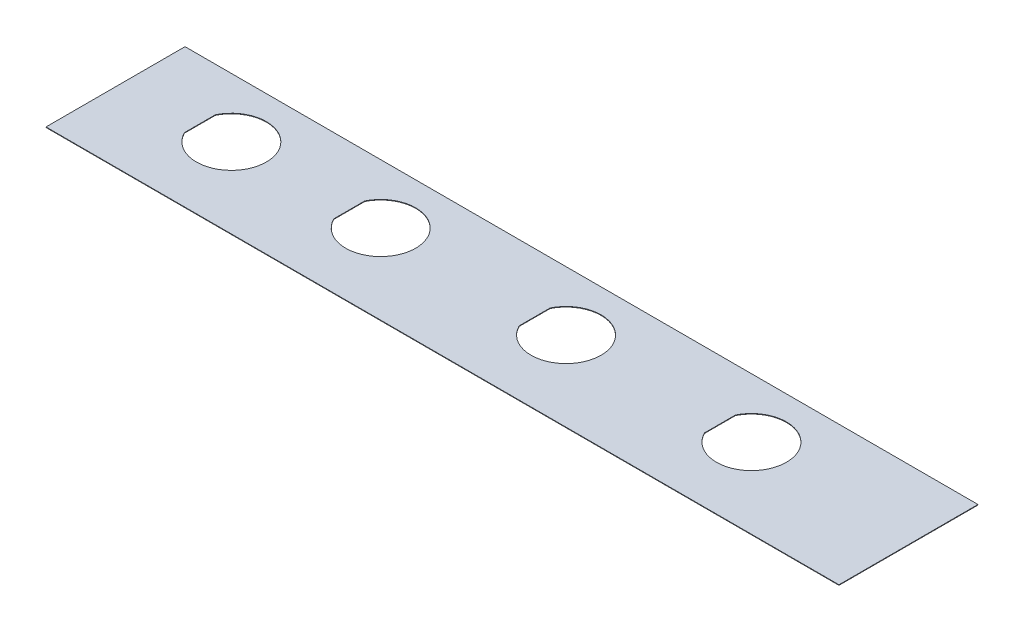
ISO-10303-21;
HEADER;
FILE_DESCRIPTION(('STEP AP214'),'2;1');
FILE_NAME('part.step','',(''),(''),'','','');
FILE_SCHEMA(('AUTOMOTIVE_DESIGN { 1 0 10303 214 1 1 1 1 }'));
ENDSEC;
DATA;
#1=APPLICATION_CONTEXT('core data for automotive mechanical design processes');
#2=APPLICATION_PROTOCOL_DEFINITION('international standard','automotive_design',2000,#1);
#3=PRODUCT_CONTEXT('',#1,'mechanical');
#4=PRODUCT('Part','Part','',(#3));
#5=PRODUCT_RELATED_PRODUCT_CATEGORY('part','',(#4));
#6=PRODUCT_DEFINITION_FORMATION('','',#4);
#7=PRODUCT_DEFINITION_CONTEXT('part definition',#1,'design');
#8=PRODUCT_DEFINITION('design','',#6,#7);
#9=PRODUCT_DEFINITION_SHAPE('','',#8);
#10=(LENGTH_UNIT() NAMED_UNIT(*) SI_UNIT(.MILLI.,.METRE.));
#11=(NAMED_UNIT(*) PLANE_ANGLE_UNIT() SI_UNIT($,.RADIAN.));
#12=(NAMED_UNIT(*) SI_UNIT($,.STERADIAN.) SOLID_ANGLE_UNIT());
#13=UNCERTAINTY_MEASURE_WITH_UNIT(LENGTH_MEASURE(1.E-05),#10,'distance_accuracy_value','');
#14=(GEOMETRIC_REPRESENTATION_CONTEXT(3) GLOBAL_UNCERTAINTY_ASSIGNED_CONTEXT((#13)) GLOBAL_UNIT_ASSIGNED_CONTEXT((#10,
#11,#12)) REPRESENTATION_CONTEXT('',''));
#15=CARTESIAN_POINT('',(0.,0.,0.));
#16=DIRECTION('',(0.,0.,1.));
#17=DIRECTION('',(1.,0.,0.));
#18=AXIS2_PLACEMENT_3D('',#15,#16,#17);
#19=CARTESIAN_POINT('',(77.,0.1,-13.5));
#20=DIRECTION('',(-1.,0.,0.));
#21=DIRECTION('',(0.,0.,1.));
#22=AXIS2_PLACEMENT_3D('',#19,#20,#21);
#23=PLANE('',#22);
#24=DIRECTION('',(0.,0.,-1.));
#25=VECTOR('',#24,1.);
#26=CARTESIAN_POINT('',(77.,0.,-13.5));
#27=LINE('',#26,#25);
#28=CARTESIAN_POINT('',(77.,0.,13.5));
#29=VERTEX_POINT('',#28);
#30=CARTESIAN_POINT('',(77.,0.,-13.5));
#31=VERTEX_POINT('',#30);
#32=EDGE_CURVE('E195',#29,#31,#27,.T.);
#33=ORIENTED_EDGE('',*,*,#32,.T.);
#34=DIRECTION('',(0.,-1.,0.));
#35=VECTOR('',#34,1.);
#36=CARTESIAN_POINT('',(77.,0.1,-13.5));
#37=LINE('',#36,#35);
#38=CARTESIAN_POINT('',(77.,0.1,-13.5));
#39=VERTEX_POINT('',#38);
#40=EDGE_CURVE('E11',#39,#31,#37,.T.);
#41=ORIENTED_EDGE('',*,*,#40,.F.);
#42=DIRECTION('',(0.,0.,-1.));
#43=VECTOR('',#42,1.);
#44=CARTESIAN_POINT('',(77.,0.1,-13.5));
#45=LINE('',#44,#43);
#46=CARTESIAN_POINT('',(77.,0.1,13.5));
#47=VERTEX_POINT('',#46);
#48=EDGE_CURVE('E198',#47,#39,#45,.T.);
#49=ORIENTED_EDGE('',*,*,#48,.F.);
#50=DIRECTION('',(0.,-1.,0.));
#51=VECTOR('',#50,1.);
#52=CARTESIAN_POINT('',(77.,0.1,13.5));
#53=LINE('',#52,#51);
#54=EDGE_CURVE('E208',#47,#29,#53,.T.);
#55=ORIENTED_EDGE('',*,*,#54,.T.);
#56=EDGE_LOOP('',(#33,#41,#49,#55));
#57=FACE_BOUND('',#56,.T.);
#58=ADVANCED_FACE('F40',(#57),#23,.F.);
#59=CARTESIAN_POINT('',(-77.,0.1,-13.5));
#60=DIRECTION('',(0.,0.,1.));
#61=DIRECTION('',(1.,0.,0.));
#62=AXIS2_PLACEMENT_3D('',#59,#60,#61);
#63=PLANE('',#62);
#64=DIRECTION('',(-1.,0.,0.));
#65=VECTOR('',#64,1.);
#66=CARTESIAN_POINT('',(-77.,0.,-13.5));
#67=LINE('',#66,#65);
#68=CARTESIAN_POINT('',(-77.,0.,-13.5));
#69=VERTEX_POINT('',#68);
#70=EDGE_CURVE('E211',#31,#69,#67,.T.);
#71=ORIENTED_EDGE('',*,*,#70,.T.);
#72=DIRECTION('',(0.,-1.,0.));
#73=VECTOR('',#72,1.);
#74=CARTESIAN_POINT('',(-77.,0.1,-13.5));
#75=LINE('',#74,#73);
#76=CARTESIAN_POINT('',(-77.,0.1,-13.5));
#77=VERTEX_POINT('',#76);
#78=EDGE_CURVE('E47',#77,#69,#75,.T.);
#79=ORIENTED_EDGE('',*,*,#78,.F.);
#80=DIRECTION('',(-1.,0.,0.));
#81=VECTOR('',#80,1.);
#82=CARTESIAN_POINT('',(-77.,0.1,-13.5));
#83=LINE('',#82,#81);
#84=EDGE_CURVE('E201',#39,#77,#83,.T.);
#85=ORIENTED_EDGE('',*,*,#84,.F.);
#86=ORIENTED_EDGE('',*,*,#40,.T.);
#87=EDGE_LOOP('',(#71,#79,#85,#86));
#88=FACE_BOUND('',#87,.T.);
#89=ADVANCED_FACE('F240',(#88),#63,.F.);
#90=CARTESIAN_POINT('',(-77.,0.1,-13.5));
#91=DIRECTION('',(1.,0.,0.));
#92=DIRECTION('',(0.,0.,-1.));
#93=AXIS2_PLACEMENT_3D('',#90,#91,#92);
#94=PLANE('',#93);
#95=DIRECTION('',(0.,0.,1.));
#96=VECTOR('',#95,1.);
#97=CARTESIAN_POINT('',(-77.,0.,-13.5));
#98=LINE('',#97,#96);
#99=CARTESIAN_POINT('',(-77.,0.,13.5));
#100=VERTEX_POINT('',#99);
#101=EDGE_CURVE('E213',#69,#100,#98,.T.);
#102=ORIENTED_EDGE('',*,*,#101,.T.);
#103=DIRECTION('',(0.,-1.,0.));
#104=VECTOR('',#103,1.);
#105=CARTESIAN_POINT('',(-77.,0.1,13.5));
#106=LINE('',#105,#104);
#107=CARTESIAN_POINT('',(-77.,0.1,13.5));
#108=VERTEX_POINT('',#107);
#109=EDGE_CURVE('E218',#108,#100,#106,.T.);
#110=ORIENTED_EDGE('',*,*,#109,.F.);
#111=DIRECTION('',(0.,0.,1.));
#112=VECTOR('',#111,1.);
#113=CARTESIAN_POINT('',(-77.,0.1,-13.5));
#114=LINE('',#113,#112);
#115=EDGE_CURVE('E204',#77,#108,#114,.T.);
#116=ORIENTED_EDGE('',*,*,#115,.F.);
#117=ORIENTED_EDGE('',*,*,#78,.T.);
#118=EDGE_LOOP('',(#102,#110,#116,#117));
#119=FACE_BOUND('',#118,.T.);
#120=ADVANCED_FACE('F225',(#119),#94,.F.);
#121=CARTESIAN_POINT('',(-77.,0.1,13.5));
#122=DIRECTION('',(0.,0.,-1.));
#123=DIRECTION('',(-1.,0.,0.));
#124=AXIS2_PLACEMENT_3D('',#121,#122,#123);
#125=PLANE('',#124);
#126=DIRECTION('',(1.,0.,0.));
#127=VECTOR('',#126,1.);
#128=CARTESIAN_POINT('',(-77.,0.,13.5));
#129=LINE('',#128,#127);
#130=EDGE_CURVE('E202',#100,#29,#129,.T.);
#131=ORIENTED_EDGE('',*,*,#130,.T.);
#132=ORIENTED_EDGE('',*,*,#54,.F.);
#133=DIRECTION('',(1.,0.,0.));
#134=VECTOR('',#133,1.);
#135=CARTESIAN_POINT('',(-77.,0.1,13.5));
#136=LINE('',#135,#134);
#137=EDGE_CURVE('E206',#108,#47,#136,.T.);
#138=ORIENTED_EDGE('',*,*,#137,.F.);
#139=ORIENTED_EDGE('',*,*,#109,.T.);
#140=EDGE_LOOP('',(#131,#132,#138,#139));
#141=FACE_BOUND('',#140,.T.);
#142=ADVANCED_FACE('F233',(#141),#125,.F.);
#143=CARTESIAN_POINT('',(0.,0.1,0.));
#144=DIRECTION('',(0.,1.,0.));
#145=DIRECTION('',(0.,0.,1.));
#146=AXIS2_PLACEMENT_3D('',#143,#144,#145);
#147=PLANE('',#146);
#148=CARTESIAN_POINT('',(-56.5,0.1,-2.));
#149=DIRECTION('',(0.,1.,0.));
#150=DIRECTION('',(0.,0.,1.));
#151=AXIS2_PLACEMENT_3D('',#148,#149,#150);
#152=CIRCLE('',#151,6.8);
#153=CARTESIAN_POINT('',(-62.6,0.1,1.00499584026336));
#154=VERTEX_POINT('',#153);
#155=CARTESIAN_POINT('',(-62.6,0.1,-5.00499584026335));
#156=VERTEX_POINT('',#155);
#157=EDGE_CURVE('E54',#154,#156,#152,.T.);
#158=ORIENTED_EDGE('',*,*,#157,.F.);
#159=DIRECTION('',(0.,0.,1.));
#160=VECTOR('',#159,1.);
#161=CARTESIAN_POINT('',(-62.6,0.1,-5.00499584026335));
#162=LINE('',#161,#160);
#163=EDGE_CURVE('E173',#156,#154,#162,.T.);
#164=ORIENTED_EDGE('',*,*,#163,.F.);
#165=EDGE_LOOP('',(#158,#164));
#166=FACE_BOUND('',#165,.T.);
#167=CARTESIAN_POINT('',(-27.5,0.1,-2.));
#168=DIRECTION('',(0.,1.,0.));
#169=DIRECTION('',(0.,0.,1.));
#170=AXIS2_PLACEMENT_3D('',#167,#168,#169);
#171=CIRCLE('',#170,6.8);
#172=CARTESIAN_POINT('',(-33.6,0.1,1.00499584026335));
#173=VERTEX_POINT('',#172);
#174=CARTESIAN_POINT('',(-33.6,0.1,-5.00499584026334));
#175=VERTEX_POINT('',#174);
#176=EDGE_CURVE('E62',#173,#175,#171,.T.);
#177=ORIENTED_EDGE('',*,*,#176,.F.);
#178=DIRECTION('',(0.,0.,1.));
#179=VECTOR('',#178,1.);
#180=CARTESIAN_POINT('',(-33.6,0.1,-5.00499584026334));
#181=LINE('',#180,#179);
#182=EDGE_CURVE('E159',#175,#173,#181,.T.);
#183=ORIENTED_EDGE('',*,*,#182,.F.);
#184=EDGE_LOOP('',(#177,#183));
#185=FACE_BOUND('',#184,.T.);
#186=CARTESIAN_POINT('',(44.5,0.1,-2.));
#187=DIRECTION('',(0.,1.,0.));
#188=DIRECTION('',(0.,0.,1.));
#189=AXIS2_PLACEMENT_3D('',#186,#187,#188);
#190=CIRCLE('',#189,6.8);
#191=CARTESIAN_POINT('',(38.4,0.1,1.00499584026335));
#192=VERTEX_POINT('',#191);
#193=CARTESIAN_POINT('',(38.4,0.1,-5.00499584026334));
#194=VERTEX_POINT('',#193);
#195=EDGE_CURVE('E134',#192,#194,#190,.T.);
#196=ORIENTED_EDGE('',*,*,#195,.F.);
#197=DIRECTION('',(0.,0.,1.));
#198=VECTOR('',#197,1.);
#199=CARTESIAN_POINT('',(38.4,0.1,-5.00499584026334));
#200=LINE('',#199,#198);
#201=EDGE_CURVE('E147',#194,#192,#200,.T.);
#202=ORIENTED_EDGE('',*,*,#201,.F.);
#203=EDGE_LOOP('',(#196,#202));
#204=FACE_BOUND('',#203,.T.);
#205=CARTESIAN_POINT('',(8.49999999999999,0.1,-2.));
#206=DIRECTION('',(0.,1.,0.));
#207=DIRECTION('',(0.,0.,1.));
#208=AXIS2_PLACEMENT_3D('',#205,#206,#207);
#209=CIRCLE('',#208,6.8);
#210=CARTESIAN_POINT('',(2.39999999999999,0.1,1.00499584026335));
#211=VERTEX_POINT('',#210);
#212=CARTESIAN_POINT('',(2.39999999999999,0.1,-5.00499584026334));
#213=VERTEX_POINT('',#212);
#214=EDGE_CURVE('E153',#211,#213,#209,.T.);
#215=ORIENTED_EDGE('',*,*,#214,.F.);
#216=DIRECTION('',(0.,0.,1.));
#217=VECTOR('',#216,1.);
#218=CARTESIAN_POINT('',(2.39999999999999,0.1,-5.00499584026334));
#219=LINE('',#218,#217);
#220=EDGE_CURVE('E186',#213,#211,#219,.T.);
#221=ORIENTED_EDGE('',*,*,#220,.F.);
#222=EDGE_LOOP('',(#215,#221));
#223=FACE_BOUND('',#222,.T.);
#224=ORIENTED_EDGE('',*,*,#48,.T.);
#225=ORIENTED_EDGE('',*,*,#84,.T.);
#226=ORIENTED_EDGE('',*,*,#115,.T.);
#227=ORIENTED_EDGE('',*,*,#137,.T.);
#228=EDGE_LOOP('',(#224,#225,#226,#227));
#229=FACE_BOUND('',#228,.T.);
#230=ADVANCED_FACE('F239',(#166,#185,#204,#223,#229),#147,.T.);
#231=CARTESIAN_POINT('',(0.,0.,0.));
#232=DIRECTION('',(0.,1.,0.));
#233=DIRECTION('',(0.,0.,1.));
#234=AXIS2_PLACEMENT_3D('',#231,#232,#233);
#235=PLANE('',#234);
#236=DIRECTION('',(0.,0.,1.));
#237=VECTOR('',#236,1.);
#238=CARTESIAN_POINT('',(-62.6,0.,-5.00499584026335));
#239=LINE('',#238,#237);
#240=CARTESIAN_POINT('',(-62.6,0.,-5.00499584026335));
#241=VERTEX_POINT('',#240);
#242=CARTESIAN_POINT('',(-62.6,0.,1.00499584026336));
#243=VERTEX_POINT('',#242);
#244=EDGE_CURVE('E172',#241,#243,#239,.T.);
#245=ORIENTED_EDGE('',*,*,#244,.T.);
#246=CARTESIAN_POINT('',(-56.5,0.,-2.));
#247=DIRECTION('',(0.,1.,0.));
#248=DIRECTION('',(0.,0.,1.));
#249=AXIS2_PLACEMENT_3D('',#246,#247,#248);
#250=CIRCLE('',#249,6.8);
#251=EDGE_CURVE('E169',#243,#241,#250,.T.);
#252=ORIENTED_EDGE('',*,*,#251,.T.);
#253=EDGE_LOOP('',(#245,#252));
#254=FACE_BOUND('',#253,.T.);
#255=DIRECTION('',(0.,0.,1.));
#256=VECTOR('',#255,1.);
#257=CARTESIAN_POINT('',(-33.6,0.,-5.00499584026334));
#258=LINE('',#257,#256);
#259=CARTESIAN_POINT('',(-33.6,0.,-5.00499584026334));
#260=VERTEX_POINT('',#259);
#261=CARTESIAN_POINT('',(-33.6,0.,1.00499584026335));
#262=VERTEX_POINT('',#261);
#263=EDGE_CURVE('E158',#260,#262,#258,.T.);
#264=ORIENTED_EDGE('',*,*,#263,.T.);
#265=CARTESIAN_POINT('',(-27.5,0.,-2.));
#266=DIRECTION('',(0.,1.,0.));
#267=DIRECTION('',(0.,0.,1.));
#268=AXIS2_PLACEMENT_3D('',#265,#266,#267);
#269=CIRCLE('',#268,6.8);
#270=EDGE_CURVE('E155',#262,#260,#269,.T.);
#271=ORIENTED_EDGE('',*,*,#270,.T.);
#272=EDGE_LOOP('',(#264,#271));
#273=FACE_BOUND('',#272,.T.);
#274=DIRECTION('',(0.,0.,1.));
#275=VECTOR('',#274,1.);
#276=CARTESIAN_POINT('',(38.4,0.,-5.00499584026334));
#277=LINE('',#276,#275);
#278=CARTESIAN_POINT('',(38.4,0.,-5.00499584026334));
#279=VERTEX_POINT('',#278);
#280=CARTESIAN_POINT('',(38.4,0.,1.00499584026335));
#281=VERTEX_POINT('',#280);
#282=EDGE_CURVE('E139',#279,#281,#277,.T.);
#283=ORIENTED_EDGE('',*,*,#282,.T.);
#284=CARTESIAN_POINT('',(44.5,0.,-2.));
#285=DIRECTION('',(0.,1.,0.));
#286=DIRECTION('',(0.,0.,1.));
#287=AXIS2_PLACEMENT_3D('',#284,#285,#286);
#288=CIRCLE('',#287,6.8);
#289=EDGE_CURVE('E131',#281,#279,#288,.T.);
#290=ORIENTED_EDGE('',*,*,#289,.T.);
#291=EDGE_LOOP('',(#283,#290));
#292=FACE_BOUND('',#291,.T.);
#293=DIRECTION('',(0.,0.,1.));
#294=VECTOR('',#293,1.);
#295=CARTESIAN_POINT('',(2.39999999999999,0.,-5.00499584026334));
#296=LINE('',#295,#294);
#297=CARTESIAN_POINT('',(2.39999999999999,0.,-5.00499584026334));
#298=VERTEX_POINT('',#297);
#299=CARTESIAN_POINT('',(2.39999999999999,0.,1.00499584026335));
#300=VERTEX_POINT('',#299);
#301=EDGE_CURVE('E185',#298,#300,#296,.T.);
#302=ORIENTED_EDGE('',*,*,#301,.T.);
#303=CARTESIAN_POINT('',(8.49999999999999,0.,-2.));
#304=DIRECTION('',(0.,1.,0.));
#305=DIRECTION('',(0.,0.,1.));
#306=AXIS2_PLACEMENT_3D('',#303,#304,#305);
#307=CIRCLE('',#306,6.8);
#308=EDGE_CURVE('E182',#300,#298,#307,.T.);
#309=ORIENTED_EDGE('',*,*,#308,.T.);
#310=EDGE_LOOP('',(#302,#309));
#311=FACE_BOUND('',#310,.T.);
#312=ORIENTED_EDGE('',*,*,#32,.F.);
#313=ORIENTED_EDGE('',*,*,#130,.F.);
#314=ORIENTED_EDGE('',*,*,#101,.F.);
#315=ORIENTED_EDGE('',*,*,#70,.F.);
#316=EDGE_LOOP('',(#312,#313,#314,#315));
#317=FACE_BOUND('',#316,.T.);
#318=ADVANCED_FACE('F145',(#254,#273,#292,#311,#317),#235,.F.);
#319=CARTESIAN_POINT('',(8.49999999999999,0.,-2.));
#320=DIRECTION('',(0.,1.,0.));
#321=DIRECTION('',(0.,0.,1.));
#322=AXIS2_PLACEMENT_3D('',#319,#320,#321);
#323=CYLINDRICAL_SURFACE('',#322,6.8);
#324=ORIENTED_EDGE('',*,*,#214,.T.);
#325=DIRECTION('',(0.,1.,0.));
#326=VECTOR('',#325,1.);
#327=CARTESIAN_POINT('',(2.39999999999999,0.,-5.00499584026334));
#328=LINE('',#327,#326);
#329=EDGE_CURVE('E189',#298,#213,#328,.T.);
#330=ORIENTED_EDGE('',*,*,#329,.F.);
#331=ORIENTED_EDGE('',*,*,#308,.F.);
#332=DIRECTION('',(0.,1.,0.));
#333=VECTOR('',#332,1.);
#334=CARTESIAN_POINT('',(2.39999999999999,0.,1.00499584026335));
#335=LINE('',#334,#333);
#336=EDGE_CURVE('E193',#300,#211,#335,.T.);
#337=ORIENTED_EDGE('',*,*,#336,.T.);
#338=EDGE_LOOP('',(#324,#330,#331,#337));
#339=FACE_BOUND('',#338,.T.);
#340=ADVANCED_FACE('F252',(#339),#323,.F.);
#341=CARTESIAN_POINT('',(2.39999999999999,0.,-5.00499584026334));
#342=DIRECTION('',(-1.,0.,0.));
#343=DIRECTION('',(0.,0.,1.));
#344=AXIS2_PLACEMENT_3D('',#341,#342,#343);
#345=PLANE('',#344);
#346=ORIENTED_EDGE('',*,*,#220,.T.);
#347=ORIENTED_EDGE('',*,*,#336,.F.);
#348=ORIENTED_EDGE('',*,*,#301,.F.);
#349=ORIENTED_EDGE('',*,*,#329,.T.);
#350=EDGE_LOOP('',(#346,#347,#348,#349));
#351=FACE_BOUND('',#350,.T.);
#352=ADVANCED_FACE('F259',(#351),#345,.F.);
#353=CARTESIAN_POINT('',(44.5,0.,-2.));
#354=DIRECTION('',(0.,1.,0.));
#355=DIRECTION('',(0.,0.,1.));
#356=AXIS2_PLACEMENT_3D('',#353,#354,#355);
#357=CYLINDRICAL_SURFACE('',#356,6.8);
#358=ORIENTED_EDGE('',*,*,#195,.T.);
#359=DIRECTION('',(0.,1.,0.));
#360=VECTOR('',#359,1.);
#361=CARTESIAN_POINT('',(38.4,0.,-5.00499584026334));
#362=LINE('',#361,#360);
#363=EDGE_CURVE('E127',#279,#194,#362,.T.);
#364=ORIENTED_EDGE('',*,*,#363,.F.);
#365=ORIENTED_EDGE('',*,*,#289,.F.);
#366=DIRECTION('',(0.,1.,0.));
#367=VECTOR('',#366,1.);
#368=CARTESIAN_POINT('',(38.4,0.,1.00499584026335));
#369=LINE('',#368,#367);
#370=EDGE_CURVE('E138',#281,#192,#369,.T.);
#371=ORIENTED_EDGE('',*,*,#370,.T.);
#372=EDGE_LOOP('',(#358,#364,#365,#371));
#373=FACE_BOUND('',#372,.T.);
#374=ADVANCED_FACE('F129',(#373),#357,.F.);
#375=CARTESIAN_POINT('',(38.4,0.,-5.00499584026334));
#376=DIRECTION('',(-1.,0.,0.));
#377=DIRECTION('',(0.,0.,1.));
#378=AXIS2_PLACEMENT_3D('',#375,#376,#377);
#379=PLANE('',#378);
#380=ORIENTED_EDGE('',*,*,#201,.T.);
#381=ORIENTED_EDGE('',*,*,#370,.F.);
#382=ORIENTED_EDGE('',*,*,#282,.F.);
#383=ORIENTED_EDGE('',*,*,#363,.T.);
#384=EDGE_LOOP('',(#380,#381,#382,#383));
#385=FACE_BOUND('',#384,.T.);
#386=ADVANCED_FACE('F142',(#385),#379,.F.);
#387=CARTESIAN_POINT('',(-27.5,0.,-2.));
#388=DIRECTION('',(0.,1.,0.));
#389=DIRECTION('',(0.,0.,1.));
#390=AXIS2_PLACEMENT_3D('',#387,#388,#389);
#391=CYLINDRICAL_SURFACE('',#390,6.8);
#392=ORIENTED_EDGE('',*,*,#176,.T.);
#393=DIRECTION('',(0.,1.,0.));
#394=VECTOR('',#393,1.);
#395=CARTESIAN_POINT('',(-33.6,0.,-5.00499584026334));
#396=LINE('',#395,#394);
#397=EDGE_CURVE('E162',#260,#175,#396,.T.);
#398=ORIENTED_EDGE('',*,*,#397,.F.);
#399=ORIENTED_EDGE('',*,*,#270,.F.);
#400=DIRECTION('',(0.,1.,0.));
#401=VECTOR('',#400,1.);
#402=CARTESIAN_POINT('',(-33.6,0.,1.00499584026335));
#403=LINE('',#402,#401);
#404=EDGE_CURVE('E151',#262,#173,#403,.T.);
#405=ORIENTED_EDGE('',*,*,#404,.T.);
#406=EDGE_LOOP('',(#392,#398,#399,#405));
#407=FACE_BOUND('',#406,.T.);
#408=ADVANCED_FACE('F272',(#407),#391,.F.);
#409=CARTESIAN_POINT('',(-33.6,0.,-5.00499584026334));
#410=DIRECTION('',(-1.,0.,0.));
#411=DIRECTION('',(0.,0.,1.));
#412=AXIS2_PLACEMENT_3D('',#409,#410,#411);
#413=PLANE('',#412);
#414=ORIENTED_EDGE('',*,*,#182,.T.);
#415=ORIENTED_EDGE('',*,*,#404,.F.);
#416=ORIENTED_EDGE('',*,*,#263,.F.);
#417=ORIENTED_EDGE('',*,*,#397,.T.);
#418=EDGE_LOOP('',(#414,#415,#416,#417));
#419=FACE_BOUND('',#418,.T.);
#420=ADVANCED_FACE('F268',(#419),#413,.F.);
#421=CARTESIAN_POINT('',(-56.5,0.,-2.));
#422=DIRECTION('',(0.,1.,0.));
#423=DIRECTION('',(0.,0.,1.));
#424=AXIS2_PLACEMENT_3D('',#421,#422,#423);
#425=CYLINDRICAL_SURFACE('',#424,6.8);
#426=ORIENTED_EDGE('',*,*,#157,.T.);
#427=DIRECTION('',(0.,1.,0.));
#428=VECTOR('',#427,1.);
#429=CARTESIAN_POINT('',(-62.6,0.,-5.00499584026335));
#430=LINE('',#429,#428);
#431=EDGE_CURVE('E176',#241,#156,#430,.T.);
#432=ORIENTED_EDGE('',*,*,#431,.F.);
#433=ORIENTED_EDGE('',*,*,#251,.F.);
#434=DIRECTION('',(0.,1.,0.));
#435=VECTOR('',#434,1.);
#436=CARTESIAN_POINT('',(-62.6,0.,1.00499584026336));
#437=LINE('',#436,#435);
#438=EDGE_CURVE('E164',#243,#154,#437,.T.);
#439=ORIENTED_EDGE('',*,*,#438,.T.);
#440=EDGE_LOOP('',(#426,#432,#433,#439));
#441=FACE_BOUND('',#440,.T.);
#442=ADVANCED_FACE('F264',(#441),#425,.F.);
#443=CARTESIAN_POINT('',(-62.6,0.,-5.00499584026335));
#444=DIRECTION('',(-1.,0.,0.));
#445=DIRECTION('',(0.,0.,1.));
#446=AXIS2_PLACEMENT_3D('',#443,#444,#445);
#447=PLANE('',#446);
#448=ORIENTED_EDGE('',*,*,#163,.T.);
#449=ORIENTED_EDGE('',*,*,#438,.F.);
#450=ORIENTED_EDGE('',*,*,#244,.F.);
#451=ORIENTED_EDGE('',*,*,#431,.T.);
#452=EDGE_LOOP('',(#448,#449,#450,#451));
#453=FACE_BOUND('',#452,.T.);
#454=ADVANCED_FACE('F267',(#453),#447,.F.);
#455=CLOSED_SHELL('',(#58,#89,#120,#142,#230,#318,#340,#352,#374,#386,#408,#420,#442,#454));
#456=MANIFOLD_SOLID_BREP('B2',#455);
#457=ADVANCED_BREP_SHAPE_REPRESENTATION('',(#18,#456),#14);
#458=SHAPE_DEFINITION_REPRESENTATION(#9,#457);
ENDSEC;
END-ISO-10303-21;
